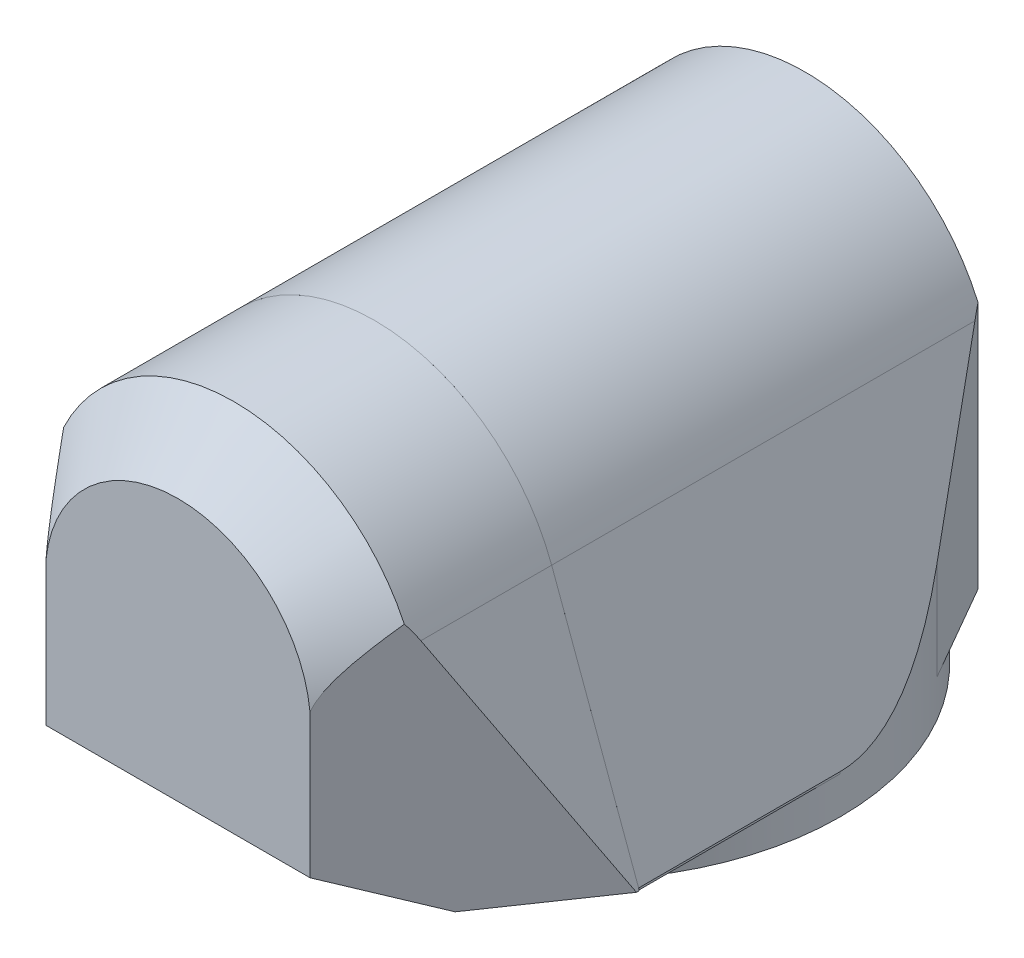
ISO-10303-21;
HEADER;
FILE_DESCRIPTION(('STEP AP214'),'2;1');
FILE_NAME('part.step','',(''),(''),'','','');
FILE_SCHEMA(('AUTOMOTIVE_DESIGN { 1 0 10303 214 1 1 1 1 }'));
ENDSEC;
DATA;
#1=APPLICATION_CONTEXT('core data for automotive mechanical design processes');
#2=APPLICATION_PROTOCOL_DEFINITION('international standard','automotive_design',2000,#1);
#3=PRODUCT_CONTEXT('',#1,'mechanical');
#4=PRODUCT('Part','Part','',(#3));
#5=PRODUCT_RELATED_PRODUCT_CATEGORY('part','',(#4));
#6=PRODUCT_DEFINITION_FORMATION('','',#4);
#7=PRODUCT_DEFINITION_CONTEXT('part definition',#1,'design');
#8=PRODUCT_DEFINITION('design','',#6,#7);
#9=PRODUCT_DEFINITION_SHAPE('','',#8);
#10=(LENGTH_UNIT() NAMED_UNIT(*) SI_UNIT(.MILLI.,.METRE.));
#11=(NAMED_UNIT(*) PLANE_ANGLE_UNIT() SI_UNIT($,.RADIAN.));
#12=(NAMED_UNIT(*) SI_UNIT($,.STERADIAN.) SOLID_ANGLE_UNIT());
#13=UNCERTAINTY_MEASURE_WITH_UNIT(LENGTH_MEASURE(1.E-05),#10,'distance_accuracy_value','');
#14=(GEOMETRIC_REPRESENTATION_CONTEXT(3) GLOBAL_UNCERTAINTY_ASSIGNED_CONTEXT((#13)) GLOBAL_UNIT_ASSIGNED_CONTEXT((#10,
#11,#12)) REPRESENTATION_CONTEXT('',''));
#15=CARTESIAN_POINT('',(0.,0.,0.));
#16=DIRECTION('',(0.,0.,1.));
#17=DIRECTION('',(1.,0.,0.));
#18=AXIS2_PLACEMENT_3D('',#15,#16,#17);
#19=CARTESIAN_POINT('',(624.999999998898,-0.0960085943478711,-5999404.5));
#20=DIRECTION('',(0.,0.,1.));
#21=DIRECTION('',(0.,1.,0.));
#22=AXIS2_PLACEMENT_3D('',#19,#20,#21);
#23=CYLINDRICAL_SURFACE('',#22,131.5);
#24=DIRECTION('',(0.,0.,1.));
#25=VECTOR('',#24,1.);
#26=CARTESIAN_POINT('',(501.607880138588,45.3642460903676,748.012532385));
#27=LINE('',#26,#25);
#28=CARTESIAN_POINT('',(501.607880138586,45.3642460903625,895.5));
#29=VERTEX_POINT('',#28);
#30=CARTESIAN_POINT('',(501.607880138574,45.3642460903694,600.525064770439));
#31=VERTEX_POINT('',#30);
#32=EDGE_CURVE('E270',#29,#31,#27,.F.);
#33=ORIENTED_EDGE('',*,*,#32,.F.);
#34=CARTESIAN_POINT('',(625.,-0.0960085954501144,895.5));
#35=DIRECTION('',(0.,0.,1.));
#36=DIRECTION('',(0.,1.,0.));
#37=AXIS2_PLACEMENT_3D('',#34,#35,#36);
#38=CIRCLE('',#37,131.5);
#39=CARTESIAN_POINT('',(748.392119861453,45.3642460903671,895.5));
#40=VERTEX_POINT('',#39);
#41=EDGE_CURVE('E248',#40,#29,#38,.T.);
#42=ORIENTED_EDGE('',*,*,#41,.F.);
#43=DIRECTION('',(0.,0.,1.));
#44=VECTOR('',#43,1.);
#45=CARTESIAN_POINT('',(748.392119860331,45.3642460914958,-5999404.5));
#46=LINE('',#45,#44);
#47=CARTESIAN_POINT('',(748.392119861436,45.3642460903994,600.525064770332));
#48=VERTEX_POINT('',#47);
#49=EDGE_CURVE('E278',#40,#48,#46,.F.);
#50=ORIENTED_EDGE('',*,*,#49,.T.);
#51=CARTESIAN_POINT('',(625.,-0.0960085954500312,386.130978732951));
#52=DIRECTION('',(-0.866704428360179,0.,0.498822046285903));
#53=DIRECTION('',(0.498822046285903,0.,0.866704428360179));
#54=AXIS2_PLACEMENT_3D('',#51,#52,#53);
#55=ELLIPSE('',#54,263.621066829573,131.5);
#56=CARTESIAN_POINT('',(745.499999999892,52.5537777291493,595.499999999817));
#57=VERTEX_POINT('',#56);
#58=EDGE_CURVE('E284',#48,#57,#55,.T.);
#59=ORIENTED_EDGE('',*,*,#58,.T.);
#60=CARTESIAN_POINT('',(625.,-0.0960085954500589,595.499999999817));
#61=DIRECTION('',(0.,0.,1.));
#62=DIRECTION('',(0.,1.,0.));
#63=AXIS2_PLACEMENT_3D('',#60,#61,#62);
#64=CIRCLE('',#63,131.5);
#65=CARTESIAN_POINT('',(504.500000000339,52.5537777296774,595.499999999817));
#66=VERTEX_POINT('',#65);
#67=EDGE_CURVE('E245',#66,#57,#64,.F.);
#68=ORIENTED_EDGE('',*,*,#67,.F.);
#69=CARTESIAN_POINT('',(625.,-0.0960085954500312,386.130978733861));
#70=DIRECTION('',(0.866704428360069,0.,0.498822046286095));
#71=DIRECTION('',(-0.498822046286095,0.,0.866704428360069));
#72=AXIS2_PLACEMENT_3D('',#69,#70,#71);
#73=ELLIPSE('',#72,263.621066829471,131.5);
#74=EDGE_CURVE('E259',#66,#31,#73,.T.);
#75=ORIENTED_EDGE('',*,*,#74,.T.);
#76=EDGE_LOOP('',(#33,#42,#50,#59,#68,#75));
#77=FACE_BOUND('',#76,.T.);
#78=ADVANCED_FACE('F18',(#77),#23,.T.);
#79=CARTESIAN_POINT('',(625.,6.7115156593229,595.5));
#80=DIRECTION('',(0.,0.,-1.));
#81=DIRECTION('',(0.,-1.,0.));
#82=AXIS2_PLACEMENT_3D('',#79,#80,#81);
#83=PLANE('',#82);
#84=ORIENTED_EDGE('',*,*,#67,.T.);
#85=DIRECTION('',(0.,-1.,0.));
#86=VECTOR('',#85,1.);
#87=CARTESIAN_POINT('',(745.5,6.7115156593229,595.5));
#88=LINE('',#87,#86);
#89=CARTESIAN_POINT('',(745.5,-120.5,595.5));
#90=VERTEX_POINT('',#89);
#91=EDGE_CURVE('E288',#57,#90,#88,.T.);
#92=ORIENTED_EDGE('',*,*,#91,.T.);
#93=DIRECTION('',(-1.,0.,0.));
#94=VECTOR('',#93,1.);
#95=CARTESIAN_POINT('',(625.,-120.5,595.5));
#96=LINE('',#95,#94);
#97=CARTESIAN_POINT('',(716.737396954574,-120.500000000178,595.5));
#98=VERTEX_POINT('',#97);
#99=EDGE_CURVE('E295',#90,#98,#96,.T.);
#100=ORIENTED_EDGE('',*,*,#99,.T.);
#101=DIRECTION('',(-1.,0.,0.));
#102=VECTOR('',#101,1.);
#103=CARTESIAN_POINT('',(625.00000000002,-120.5,595.5));
#104=LINE('',#103,#102);
#105=CARTESIAN_POINT('',(533.262603045422,-120.500000000178,595.5));
#106=VERTEX_POINT('',#105);
#107=EDGE_CURVE('E252',#106,#98,#104,.F.);
#108=ORIENTED_EDGE('',*,*,#107,.F.);
#109=DIRECTION('',(-1.,0.,0.));
#110=VECTOR('',#109,1.);
#111=CARTESIAN_POINT('',(625.,-120.5,595.5));
#112=LINE('',#111,#110);
#113=CARTESIAN_POINT('',(504.5,-120.5,595.5));
#114=VERTEX_POINT('',#113);
#115=EDGE_CURVE('E255',#106,#114,#112,.T.);
#116=ORIENTED_EDGE('',*,*,#115,.T.);
#117=DIRECTION('',(0.,-1.,0.));
#118=VECTOR('',#117,1.);
#119=CARTESIAN_POINT('',(504.5,6.71151565932292,595.5));
#120=LINE('',#119,#118);
#121=EDGE_CURVE('E263',#114,#66,#120,.F.);
#122=ORIENTED_EDGE('',*,*,#121,.T.);
#123=EDGE_LOOP('',(#84,#92,#100,#108,#116,#122));
#124=FACE_BOUND('',#123,.T.);
#125=ADVANCED_FACE('F447',(#124),#83,.T.);
#126=CARTESIAN_POINT('',(625.,5.46158088944987,895.5));
#127=DIRECTION('',(0.,0.,1.));
#128=DIRECTION('',(0.,1.,0.));
#129=AXIS2_PLACEMENT_3D('',#126,#127,#128);
#130=PLANE('',#129);
#131=DIRECTION('',(-0.345712683862874,-0.938340418087342,0.));
#132=VECTOR('',#131,1.);
#133=CARTESIAN_POINT('',(471.05411751075,-37.5693910360001,895.5));
#134=LINE('',#133,#132);
#135=CARTESIAN_POINT('',(501.608235021519,45.3612179279794,895.5));
#136=VERTEX_POINT('',#135);
#137=CARTESIAN_POINT('',(441.,-119.142873472147,895.5));
#138=VERTEX_POINT('',#137);
#139=EDGE_CURVE('E47',#136,#138,#134,.T.);
#140=ORIENTED_EDGE('',*,*,#139,.F.);
#141=CARTESIAN_POINT('',(625.,-0.1000000000001,895.5));
#142=DIRECTION('',(0.,0.,-1.));
#143=DIRECTION('',(0.,-1.,0.));
#144=AXIS2_PLACEMENT_3D('',#141,#142,#143);
#145=CIRCLE('',#144,131.5);
#146=CARTESIAN_POINT('',(748.391764978489,45.36121792796,895.5));
#147=VERTEX_POINT('',#146);
#148=EDGE_CURVE('E40',#136,#147,#145,.T.);
#149=ORIENTED_EDGE('',*,*,#148,.T.);
#150=DIRECTION('',(-0.345712683862974,0.938340418087306,0.));
#151=VECTOR('',#150,1.);
#152=CARTESIAN_POINT('',(778.94588248924,-37.5693910360001,895.5));
#153=LINE('',#152,#151);
#154=CARTESIAN_POINT('',(809.,-119.142873472148,895.5));
#155=VERTEX_POINT('',#154);
#156=EDGE_CURVE('E224',#155,#147,#153,.T.);
#157=ORIENTED_EDGE('',*,*,#156,.F.);
#158=DIRECTION('',(-0.345705358827259,0.938343116817146,0.));
#159=VECTOR('',#158,1.);
#160=CARTESIAN_POINT('',(809.,-119.14285714286,895.5));
#161=LINE('',#160,#159);
#162=EDGE_CURVE('E283',#155,#40,#161,.T.);
#163=ORIENTED_EDGE('',*,*,#162,.T.);
#164=ORIENTED_EDGE('',*,*,#41,.T.);
#165=DIRECTION('',(-0.34570535882751,-0.938343116817054,0.));
#166=VECTOR('',#165,1.);
#167=CARTESIAN_POINT('',(471.000900668607,-37.7118410423964,895.5));
#168=LINE('',#167,#166);
#169=EDGE_CURVE('E275',#138,#29,#168,.F.);
#170=ORIENTED_EDGE('',*,*,#169,.F.);
#171=EDGE_LOOP('',(#140,#149,#157,#163,#164,#170));
#172=FACE_BOUND('',#171,.T.);
#173=ADVANCED_FACE('F451',(#172),#130,.T.);
#174=CARTESIAN_POINT('',(625.00000000002,-120.5,753.159999999493));
#175=DIRECTION('',(0.,1.,0.));
#176=DIRECTION('',(-1.,0.,0.));
#177=AXIS2_PLACEMENT_3D('',#174,#175,#176);
#178=PLANE('',#177);
#179=ORIENTED_EDGE('',*,*,#107,.T.);
#180=CARTESIAN_POINT('',(625.,-120.500000000355,755.));
#181=DIRECTION('',(0.,1.,0.));
#182=DIRECTION('',(-1.,0.,0.));
#183=AXIS2_PLACEMENT_3D('',#180,#181,#182);
#184=CIRCLE('',#183,184.);
#185=EDGE_CURVE('E310',#98,#106,#184,.T.);
#186=ORIENTED_EDGE('',*,*,#185,.T.);
#187=EDGE_LOOP('',(#179,#186));
#188=FACE_BOUND('',#187,.T.);
#189=ADVANCED_FACE('F455',(#188),#178,.T.);
#190=CARTESIAN_POINT('',(625.,-120.5,745.5));
#191=DIRECTION('',(0.,1.,0.));
#192=DIRECTION('',(-1.,0.,0.));
#193=AXIS2_PLACEMENT_3D('',#190,#191,#192);
#194=PLANE('',#193);
#195=DIRECTION('',(0.498822046286095,0.,-0.866704428360069));
#196=VECTOR('',#195,1.);
#197=CARTESIAN_POINT('',(465.5263851817,-120.5,663.2167434834));
#198=LINE('',#197,#196);
#199=CARTESIAN_POINT('',(465.526385181715,-120.500000000178,663.216743483374));
#200=VERTEX_POINT('',#199);
#201=EDGE_CURVE('E258',#200,#114,#198,.T.);
#202=ORIENTED_EDGE('',*,*,#201,.T.);
#203=ORIENTED_EDGE('',*,*,#115,.F.);
#204=CARTESIAN_POINT('',(625.,-120.500000000355,755.));
#205=DIRECTION('',(0.,1.,0.));
#206=DIRECTION('',(-1.,0.,0.));
#207=AXIS2_PLACEMENT_3D('',#204,#205,#206);
#208=CIRCLE('',#207,184.);
#209=EDGE_CURVE('E336',#106,#200,#208,.T.);
#210=ORIENTED_EDGE('',*,*,#209,.T.);
#211=EDGE_LOOP('',(#202,#203,#210));
#212=FACE_BOUND('',#211,.T.);
#213=ADVANCED_FACE('F458',(#212),#194,.F.);
#214=CARTESIAN_POINT('',(485.01319259085,-33.9731111355501,629.3583717417));
#215=DIRECTION('',(0.866704428360069,0.,0.498822046286095));
#216=DIRECTION('',(0.498822046286095,0.,-0.866704428360069));
#217=AXIS2_PLACEMENT_3D('',#214,#215,#216);
#218=PLANE('',#217);
#219=ORIENTED_EDGE('',*,*,#74,.F.);
#220=ORIENTED_EDGE('',*,*,#121,.F.);
#221=ORIENTED_EDGE('',*,*,#201,.F.);
#222=DIRECTION('',(0.,1.,0.));
#223=VECTOR('',#222,1.);
#224=CARTESIAN_POINT('',(465.5263851817,-33.9731111355501,663.2167434834));
#225=LINE('',#224,#223);
#226=CARTESIAN_POINT('',(465.526385181708,-52.5712402217139,663.216743483405));
#227=VERTEX_POINT('',#226);
#228=EDGE_CURVE('E332',#200,#227,#225,.T.);
#229=ORIENTED_EDGE('',*,*,#228,.T.);
#230=DIRECTION('',(-0.296353071286836,-0.804386907778148,0.514914128504908));
#231=VECTOR('',#230,1.);
#232=CARTESIAN_POINT('',(501.607880138573,45.364246090326,600.525064769976));
#233=LINE('',#232,#231);
#234=EDGE_CURVE('E262',#31,#227,#233,.T.);
#235=ORIENTED_EDGE('',*,*,#234,.F.);
#236=EDGE_LOOP('',(#219,#220,#221,#229,#235));
#237=FACE_BOUND('',#236,.T.);
#238=ADVANCED_FACE('F462',(#237),#218,.F.);
#239=CARTESIAN_POINT('',(471.000900668607,-37.7118410423964,748.012532385));
#240=DIRECTION('',(-0.938343116817054,0.34570535882751,0.));
#241=DIRECTION('',(-0.34570535882751,-0.938343116817054,0.));
#242=AXIS2_PLACEMENT_3D('',#239,#240,#241);
#243=PLANE('',#242);
#244=ORIENTED_EDGE('',*,*,#169,.T.);
#245=ORIENTED_EDGE('',*,*,#32,.T.);
#246=ORIENTED_EDGE('',*,*,#234,.T.);
#247=CARTESIAN_POINT('',(625.,380.285714284219,755.));
#248=DIRECTION('',(-0.938343116817054,0.34570535882751,0.));
#249=DIRECTION('',(0.34570535882751,0.938343116817054,0.));
#250=AXIS2_PLACEMENT_3D('',#247,#248,#249);
#251=ELLIPSE('',#250,532.2451483658,184.);
#252=CARTESIAN_POINT('',(441.,-119.14285714348,755.));
#253=VERTEX_POINT('',#252);
#254=EDGE_CURVE('E328',#227,#253,#251,.T.);
#255=ORIENTED_EDGE('',*,*,#254,.T.);
#256=DIRECTION('',(0.,0.,1.));
#257=VECTOR('',#256,1.);
#258=CARTESIAN_POINT('',(441.,-119.14285714286,748.012532385));
#259=LINE('',#258,#257);
#260=EDGE_CURVE('E274',#253,#138,#259,.T.);
#261=ORIENTED_EDGE('',*,*,#260,.T.);
#262=EDGE_LOOP('',(#244,#245,#246,#255,#261));
#263=FACE_BOUND('',#262,.T.);
#264=ADVANCED_FACE('F378',(#263),#243,.T.);
#265=CARTESIAN_POINT('',(441.,-119.82142857143,825.25));
#266=DIRECTION('',(1.,0.,0.));
#267=DIRECTION('',(0.,1.,0.));
#268=AXIS2_PLACEMENT_3D('',#265,#266,#267);
#269=PLANE('',#268);
#270=ORIENTED_EDGE('',*,*,#260,.F.);
#271=DIRECTION('',(0.,1.,0.));
#272=VECTOR('',#271,1.);
#273=CARTESIAN_POINT('',(441.,-119.82142857143,755.));
#274=LINE('',#273,#272);
#275=CARTESIAN_POINT('',(441.,-120.500000000178,755.));
#276=VERTEX_POINT('',#275);
#277=EDGE_CURVE('E324',#253,#276,#274,.F.);
#278=ORIENTED_EDGE('',*,*,#277,.T.);
#279=DIRECTION('',(0.,0.,1.));
#280=VECTOR('',#279,1.);
#281=CARTESIAN_POINT('',(441.,-120.5,825.25));
#282=LINE('',#281,#280);
#283=CARTESIAN_POINT('',(441.,-120.5,895.5));
#284=VERTEX_POINT('',#283);
#285=EDGE_CURVE('E303',#276,#284,#282,.T.);
#286=ORIENTED_EDGE('',*,*,#285,.T.);
#287=DIRECTION('',(0.,1.,0.));
#288=VECTOR('',#287,1.);
#289=CARTESIAN_POINT('',(441.,5.46158088944988,895.5));
#290=LINE('',#289,#288);
#291=EDGE_CURVE('E216',#138,#284,#290,.F.);
#292=ORIENTED_EDGE('',*,*,#291,.F.);
#293=EDGE_LOOP('',(#270,#278,#286,#292));
#294=FACE_BOUND('',#293,.T.);
#295=ADVANCED_FACE('F383',(#294),#269,.F.);
#296=CARTESIAN_POINT('',(809.,-119.82142857143,825.25));
#297=DIRECTION('',(-1.,0.,0.));
#298=DIRECTION('',(0.,-1.,0.));
#299=AXIS2_PLACEMENT_3D('',#296,#297,#298);
#300=PLANE('',#299);
#301=DIRECTION('',(0.,0.,1.));
#302=VECTOR('',#301,1.);
#303=CARTESIAN_POINT('',(809.,-119.14285714286,825.25));
#304=LINE('',#303,#302);
#305=CARTESIAN_POINT('',(809.,-119.142857143686,755.000000000019));
#306=VERTEX_POINT('',#305);
#307=EDGE_CURVE('E353',#306,#155,#304,.T.);
#308=ORIENTED_EDGE('',*,*,#307,.T.);
#309=DIRECTION('',(0.,1.,0.));
#310=VECTOR('',#309,1.);
#311=CARTESIAN_POINT('',(809.,5.46158088944987,895.5));
#312=LINE('',#311,#310);
#313=CARTESIAN_POINT('',(809.,-120.5,895.5));
#314=VERTEX_POINT('',#313);
#315=EDGE_CURVE('E349',#314,#155,#312,.T.);
#316=ORIENTED_EDGE('',*,*,#315,.F.);
#317=DIRECTION('',(0.,0.,1.));
#318=VECTOR('',#317,1.);
#319=CARTESIAN_POINT('',(809.,-120.5,825.25));
#320=LINE('',#319,#318);
#321=CARTESIAN_POINT('',(809.,-120.500000000178,754.99999999999));
#322=VERTEX_POINT('',#321);
#323=EDGE_CURVE('E306',#314,#322,#320,.F.);
#324=ORIENTED_EDGE('',*,*,#323,.T.);
#325=DIRECTION('',(0.,-1.,0.));
#326=VECTOR('',#325,1.);
#327=CARTESIAN_POINT('',(809.,-119.82142857143,755.000000000019));
#328=LINE('',#327,#326);
#329=EDGE_CURVE('E320',#322,#306,#328,.F.);
#330=ORIENTED_EDGE('',*,*,#329,.T.);
#331=EDGE_LOOP('',(#308,#316,#324,#330));
#332=FACE_BOUND('',#331,.T.);
#333=ADVANCED_FACE('F471',(#332),#300,.F.);
#334=CARTESIAN_POINT('',(778.999099331418,-37.7118410423964,748.012532385));
#335=DIRECTION('',(-0.938343116817146,-0.345705358827259,0.));
#336=DIRECTION('',(0.345705358827259,-0.938343116817146,0.));
#337=AXIS2_PLACEMENT_3D('',#334,#335,#336);
#338=PLANE('',#337);
#339=ORIENTED_EDGE('',*,*,#162,.F.);
#340=ORIENTED_EDGE('',*,*,#307,.F.);
#341=CARTESIAN_POINT('',(625.,380.285714284219,755.));
#342=DIRECTION('',(-0.938343116817146,-0.345705358827259,0.));
#343=DIRECTION('',(-0.345705358827259,0.938343116817146,0.));
#344=AXIS2_PLACEMENT_3D('',#341,#342,#343);
#345=ELLIPSE('',#344,532.245148366187,184.);
#346=CARTESIAN_POINT('',(784.473614818289,-52.5712402218787,663.216743483416));
#347=VERTEX_POINT('',#346);
#348=EDGE_CURVE('E316',#306,#347,#345,.F.);
#349=ORIENTED_EDGE('',*,*,#348,.T.);
#350=DIRECTION('',(-0.296353071286602,0.804386907778178,-0.514914128504995));
#351=VECTOR('',#350,1.);
#352=CARTESIAN_POINT('',(784.473614818284,-52.5712402210386,663.2167434834));
#353=LINE('',#352,#351);
#354=EDGE_CURVE('E282',#347,#48,#353,.T.);
#355=ORIENTED_EDGE('',*,*,#354,.T.);
#356=ORIENTED_EDGE('',*,*,#49,.F.);
#357=EDGE_LOOP('',(#339,#340,#349,#355,#356));
#358=FACE_BOUND('',#357,.T.);
#359=ADVANCED_FACE('F474',(#358),#338,.F.);
#360=CARTESIAN_POINT('',(764.98680740914,-33.9731111355501,629.3583717417));
#361=DIRECTION('',(-0.866704428360179,0.,0.498822046285903));
#362=DIRECTION('',(0.498822046285903,0.,0.866704428360179));
#363=AXIS2_PLACEMENT_3D('',#360,#361,#362);
#364=PLANE('',#363);
#365=ORIENTED_EDGE('',*,*,#58,.F.);
#366=ORIENTED_EDGE('',*,*,#354,.F.);
#367=DIRECTION('',(0.,1.,0.));
#368=VECTOR('',#367,1.);
#369=CARTESIAN_POINT('',(784.47361481828,-33.9731111355501,663.2167434834));
#370=LINE('',#369,#368);
#371=CARTESIAN_POINT('',(784.473614818278,-120.500000000178,663.216743483396));
#372=VERTEX_POINT('',#371);
#373=EDGE_CURVE('E311',#347,#372,#370,.F.);
#374=ORIENTED_EDGE('',*,*,#373,.T.);
#375=DIRECTION('',(0.498822046285903,0.,0.866704428360179));
#376=VECTOR('',#375,1.);
#377=CARTESIAN_POINT('',(764.98680740914,-120.5,629.3583717417));
#378=LINE('',#377,#376);
#379=EDGE_CURVE('E299',#372,#90,#378,.F.);
#380=ORIENTED_EDGE('',*,*,#379,.T.);
#381=ORIENTED_EDGE('',*,*,#91,.F.);
#382=EDGE_LOOP('',(#365,#366,#374,#380,#381));
#383=FACE_BOUND('',#382,.T.);
#384=ADVANCED_FACE('F477',(#383),#364,.F.);
#385=CARTESIAN_POINT('',(625.,-120.5,745.5));
#386=DIRECTION('',(0.,1.,0.));
#387=DIRECTION('',(-1.,0.,0.));
#388=AXIS2_PLACEMENT_3D('',#385,#386,#387);
#389=PLANE('',#388);
#390=CARTESIAN_POINT('',(625.,-120.500000000355,755.));
#391=DIRECTION('',(0.,1.,0.));
#392=DIRECTION('',(-1.,0.,0.));
#393=AXIS2_PLACEMENT_3D('',#390,#391,#392);
#394=CIRCLE('',#393,184.);
#395=EDGE_CURVE('E315',#372,#98,#394,.T.);
#396=ORIENTED_EDGE('',*,*,#395,.T.);
#397=ORIENTED_EDGE('',*,*,#99,.F.);
#398=ORIENTED_EDGE('',*,*,#379,.F.);
#399=EDGE_LOOP('',(#396,#397,#398));
#400=FACE_BOUND('',#399,.T.);
#401=ADVANCED_FACE('F481',(#400),#389,.F.);
#402=CARTESIAN_POINT('',(625.,-120.5,745.5));
#403=DIRECTION('',(0.,1.,0.));
#404=DIRECTION('',(-1.,0.,0.));
#405=AXIS2_PLACEMENT_3D('',#402,#403,#404);
#406=PLANE('',#405);
#407=ORIENTED_EDGE('',*,*,#323,.F.);
#408=DIRECTION('',(1.,0.,0.));
#409=VECTOR('',#408,1.);
#410=CARTESIAN_POINT('',(625.,-120.5,895.5));
#411=LINE('',#410,#409);
#412=CARTESIAN_POINT('',(809.5,-120.5,895.5));
#413=VERTEX_POINT('',#412);
#414=EDGE_CURVE('E212',#314,#413,#411,.T.);
#415=ORIENTED_EDGE('',*,*,#414,.T.);
#416=DIRECTION('',(0.,0.,1.));
#417=VECTOR('',#416,1.);
#418=CARTESIAN_POINT('',(809.5,-120.5,941.0924958265));
#419=LINE('',#418,#417);
#420=CARTESIAN_POINT('',(809.5,-120.5,897.5));
#421=VERTEX_POINT('',#420);
#422=EDGE_CURVE('E218',#421,#413,#419,.F.);
#423=ORIENTED_EDGE('',*,*,#422,.F.);
#424=DIRECTION('',(0.565231440294017,0.,-0.824932372320999));
#425=VECTOR('',#424,1.);
#426=CARTESIAN_POINT('',(763.25,-120.5,965.));
#427=LINE('',#426,#425);
#428=CARTESIAN_POINT('',(758.111111111111,-120.5,972.5));
#429=VERTEX_POINT('',#428);
#430=EDGE_CURVE('E402',#429,#421,#427,.T.);
#431=ORIENTED_EDGE('',*,*,#430,.F.);
#432=DIRECTION('',(-1.,0.,0.));
#433=VECTOR('',#432,1.);
#434=CARTESIAN_POINT('',(625.,-120.5,972.5));
#435=LINE('',#434,#433);
#436=CARTESIAN_POINT('',(491.888888888888,-120.5,972.5));
#437=VERTEX_POINT('',#436);
#438=EDGE_CURVE('E403',#437,#429,#435,.F.);
#439=ORIENTED_EDGE('',*,*,#438,.F.);
#440=DIRECTION('',(-0.565231440294018,0.,-0.824932372320998));
#441=VECTOR('',#440,1.);
#442=CARTESIAN_POINT('',(491.888888888877,-120.5,972.499999999982));
#443=LINE('',#442,#441);
#444=CARTESIAN_POINT('',(440.5,-120.5,897.5));
#445=VERTEX_POINT('',#444);
#446=EDGE_CURVE('E210',#437,#445,#443,.T.);
#447=ORIENTED_EDGE('',*,*,#446,.T.);
#448=DIRECTION('',(0.,0.,1.));
#449=VECTOR('',#448,1.);
#450=CARTESIAN_POINT('',(440.5,-120.5,934.));
#451=LINE('',#450,#449);
#452=CARTESIAN_POINT('',(440.5,-120.5,895.5));
#453=VERTEX_POINT('',#452);
#454=EDGE_CURVE('E195',#445,#453,#451,.F.);
#455=ORIENTED_EDGE('',*,*,#454,.T.);
#456=EDGE_CURVE('E208',#453,#284,#411,.T.);
#457=ORIENTED_EDGE('',*,*,#456,.T.);
#458=ORIENTED_EDGE('',*,*,#285,.F.);
#459=CARTESIAN_POINT('',(625.,-120.500000000355,755.));
#460=DIRECTION('',(0.,1.,0.));
#461=DIRECTION('',(-1.,0.,0.));
#462=AXIS2_PLACEMENT_3D('',#459,#460,#461);
#463=CIRCLE('',#462,184.);
#464=EDGE_CURVE('E28',#276,#322,#463,.T.);
#465=ORIENTED_EDGE('',*,*,#464,.T.);
#466=EDGE_LOOP('',(#407,#415,#423,#431,#439,#447,#455,#457,#458,#465));
#467=FACE_BOUND('',#466,.T.);
#468=ADVANCED_FACE('F206',(#467),#406,.F.);
#469=CARTESIAN_POINT('',(624.999999999633,-6000146.5,754.999999998898));
#470=DIRECTION('',(0.,1.,0.));
#471=DIRECTION('',(-1.,0.,0.));
#472=AXIS2_PLACEMENT_3D('',#469,#470,#471);
#473=CYLINDRICAL_SURFACE('',#472,184.);
#474=ORIENTED_EDGE('',*,*,#464,.F.);
#475=ORIENTED_EDGE('',*,*,#277,.F.);
#476=ORIENTED_EDGE('',*,*,#254,.F.);
#477=ORIENTED_EDGE('',*,*,#228,.F.);
#478=ORIENTED_EDGE('',*,*,#209,.F.);
#479=ORIENTED_EDGE('',*,*,#185,.F.);
#480=ORIENTED_EDGE('',*,*,#395,.F.);
#481=ORIENTED_EDGE('',*,*,#373,.F.);
#482=ORIENTED_EDGE('',*,*,#348,.F.);
#483=ORIENTED_EDGE('',*,*,#329,.F.);
#484=EDGE_LOOP('',(#474,#475,#476,#477,#478,#479,#480,#481,#482,#483));
#485=FACE_BOUND('',#484,.T.);
#486=CARTESIAN_POINT('',(625.,-146.500000000195,755.));
#487=DIRECTION('',(0.,1.,0.));
#488=DIRECTION('',(-1.,0.,0.));
#489=AXIS2_PLACEMENT_3D('',#486,#487,#488);
#490=CIRCLE('',#489,184.);
#491=CARTESIAN_POINT('',(441.,-146.500000000195,755.));
#492=VERTEX_POINT('',#491);
#493=EDGE_CURVE('E11',#492,#492,#490,.T.);
#494=ORIENTED_EDGE('',*,*,#493,.T.);
#495=EDGE_LOOP('',(#494));
#496=FACE_BOUND('',#495,.T.);
#497=ADVANCED_FACE('F385',(#485,#496),#473,.T.);
#498=CARTESIAN_POINT('',(625.,-146.5,755.0184));
#499=DIRECTION('',(0.,1.,0.));
#500=DIRECTION('',(-1.,0.,0.));
#501=AXIS2_PLACEMENT_3D('',#498,#499,#500);
#502=PLANE('',#501);
#503=ORIENTED_EDGE('',*,*,#493,.F.);
#504=EDGE_LOOP('',(#503));
#505=FACE_BOUND('',#504,.T.);
#506=ADVANCED_FACE('F20',(#505),#502,.F.);
#507=CARTESIAN_POINT('',(625.,5.46064544109987,895.5));
#508=DIRECTION('',(0.,0.,-1.));
#509=DIRECTION('',(0.,-1.,0.));
#510=AXIS2_PLACEMENT_3D('',#507,#508,#509);
#511=PLANE('',#510);
#512=ORIENTED_EDGE('',*,*,#291,.T.);
#513=ORIENTED_EDGE('',*,*,#456,.F.);
#514=EDGE_CURVE('E191',#138,#453,#134,.T.);
#515=ORIENTED_EDGE('',*,*,#514,.F.);
#516=EDGE_LOOP('',(#512,#513,#515));
#517=FACE_BOUND('',#516,.T.);
#518=ADVANCED_FACE('F214',(#517),#511,.T.);
#519=ORIENTED_EDGE('',*,*,#315,.T.);
#520=EDGE_CURVE('E236',#413,#155,#153,.T.);
#521=ORIENTED_EDGE('',*,*,#520,.F.);
#522=ORIENTED_EDGE('',*,*,#414,.F.);
#523=EDGE_LOOP('',(#519,#521,#522));
#524=FACE_BOUND('',#523,.T.);
#525=ADVANCED_FACE('F394',(#524),#511,.T.);
#526=CARTESIAN_POINT('',(471.05411751075,-37.5693910360001,941.0924958265));
#527=DIRECTION('',(-0.938340418087342,0.345712683862874,0.));
#528=DIRECTION('',(-0.345712683862874,-0.938340418087342,0.));
#529=AXIS2_PLACEMENT_3D('',#526,#527,#528);
#530=PLANE('',#529);
#531=ORIENTED_EDGE('',*,*,#454,.F.);
#532=DIRECTION('',(0.308650586131994,0.837745716465744,0.450463017598197));
#533=VECTOR('',#532,1.);
#534=CARTESIAN_POINT('',(440.5,-120.5,897.5));
#535=LINE('',#534,#533);
#536=CARTESIAN_POINT('',(501.6082350215,45.3612179279996,986.684991652969));
#537=VERTEX_POINT('',#536);
#538=EDGE_CURVE('E531',#445,#537,#535,.T.);
#539=ORIENTED_EDGE('',*,*,#538,.T.);
#540=DIRECTION('',(0.,0.,1.));
#541=VECTOR('',#540,1.);
#542=CARTESIAN_POINT('',(501.6082350215,45.3612179279996,941.0924958265));
#543=LINE('',#542,#541);
#544=EDGE_CURVE('E239',#537,#136,#543,.F.);
#545=ORIENTED_EDGE('',*,*,#544,.T.);
#546=ORIENTED_EDGE('',*,*,#139,.T.);
#547=ORIENTED_EDGE('',*,*,#514,.T.);
#548=EDGE_LOOP('',(#531,#539,#545,#546,#547));
#549=FACE_BOUND('',#548,.T.);
#550=ADVANCED_FACE('F193',(#549),#530,.T.);
#551=CARTESIAN_POINT('',(778.94588248924,-37.5693910360001,941.0924958265));
#552=DIRECTION('',(0.938340418087306,0.345712683862974,0.));
#553=DIRECTION('',(-0.345712683862974,0.938340418087306,0.));
#554=AXIS2_PLACEMENT_3D('',#551,#552,#553);
#555=PLANE('',#554);
#556=DIRECTION('',(0.,0.,1.));
#557=VECTOR('',#556,1.);
#558=CARTESIAN_POINT('',(748.391764978497,45.3612179279552,941.0924958265));
#559=LINE('',#558,#557);
#560=CARTESIAN_POINT('',(748.391764978495,45.3612179279546,986.684991652963));
#561=VERTEX_POINT('',#560);
#562=EDGE_CURVE('E230',#147,#561,#559,.T.);
#563=ORIENTED_EDGE('',*,*,#562,.T.);
#564=DIRECTION('',(-0.30865058613211,0.837745716465692,0.450463017598215));
#565=VECTOR('',#564,1.);
#566=CARTESIAN_POINT('',(809.5,-120.5,897.5));
#567=LINE('',#566,#565);
#568=EDGE_CURVE('E400',#421,#561,#567,.T.);
#569=ORIENTED_EDGE('',*,*,#568,.F.);
#570=ORIENTED_EDGE('',*,*,#422,.T.);
#571=ORIENTED_EDGE('',*,*,#520,.T.);
#572=ORIENTED_EDGE('',*,*,#156,.T.);
#573=EDGE_LOOP('',(#563,#569,#570,#571,#572));
#574=FACE_BOUND('',#573,.T.);
#575=ADVANCED_FACE('F397',(#574),#555,.T.);
#576=CARTESIAN_POINT('',(625.000000001103,-0.100000001102302,6000993.5));
#577=DIRECTION('',(0.,0.,-1.));
#578=DIRECTION('',(0.,-1.,0.));
#579=AXIS2_PLACEMENT_3D('',#576,#577,#578);
#580=CYLINDRICAL_SURFACE('',#579,131.5);
#581=ORIENTED_EDGE('',*,*,#562,.F.);
#582=ORIENTED_EDGE('',*,*,#148,.F.);
#583=ORIENTED_EDGE('',*,*,#544,.F.);
#584=CARTESIAN_POINT('',(625.,-0.100000000000142,1166.77027027018));
#585=DIRECTION('',(0.824932372320999,0.,-0.565231440294018));
#586=DIRECTION('',(-0.565231440294018,0.,-0.824932372320999));
#587=AXIS2_PLACEMENT_3D('',#584,#585,#586);
#588=ELLIPSE('',#587,232.648063475728,131.5);
#589=CARTESIAN_POINT('',(506.277777467216,56.4445300349745,993.499999546656));
#590=VERTEX_POINT('',#589);
#591=EDGE_CURVE('E523',#537,#590,#588,.T.);
#592=ORIENTED_EDGE('',*,*,#591,.T.);
#593=CARTESIAN_POINT('',(625.,-0.100000000000114,993.499999162311));
#594=DIRECTION('',(0.,0.,-1.));
#595=DIRECTION('',(0.,-1.,0.));
#596=AXIS2_PLACEMENT_3D('',#593,#594,#595);
#597=CIRCLE('',#596,131.5);
#598=CARTESIAN_POINT('',(743.722222532485,56.4445300356017,993.499999547092));
#599=VERTEX_POINT('',#598);
#600=EDGE_CURVE('E408',#590,#599,#597,.T.);
#601=ORIENTED_EDGE('',*,*,#600,.T.);
#602=CARTESIAN_POINT('',(625.,-0.100000000000142,1166.77027027018));
#603=DIRECTION('',(0.824932372320999,0.,0.565231440294017));
#604=DIRECTION('',(0.565231440294017,0.,-0.824932372320999));
#605=AXIS2_PLACEMENT_3D('',#602,#603,#604);
#606=ELLIPSE('',#605,232.648063475728,131.5);
#607=EDGE_CURVE('E407',#561,#599,#606,.T.);
#608=ORIENTED_EDGE('',*,*,#607,.F.);
#609=EDGE_LOOP('',(#581,#582,#583,#592,#601,#608));
#610=FACE_BOUND('',#609,.T.);
#611=ADVANCED_FACE('F506',(#610),#580,.T.);
#612=CARTESIAN_POINT('',(625.,-105.5,1002.5));
#613=DIRECTION('',(0.,-0.894427190999916,0.447213595499958));
#614=DIRECTION('',(0.,0.447213595499958,0.894427190999916));
#615=AXIS2_PLACEMENT_3D('',#612,#613,#614);
#616=PLANE('',#615);
#617=ORIENTED_EDGE('',*,*,#438,.T.);
#618=DIRECTION('',(0.522527990253466,-0.381304209103873,-0.762608418207761));
#619=VECTOR('',#618,1.);
#620=CARTESIAN_POINT('',(717.,-90.5000000000024,1032.5));
#621=LINE('',#620,#619);
#622=CARTESIAN_POINT('',(717.,-90.5,1032.5));
#623=VERTEX_POINT('',#622);
#624=EDGE_CURVE('E419',#623,#429,#621,.T.);
#625=ORIENTED_EDGE('',*,*,#624,.F.);
#626=DIRECTION('',(-1.,0.,0.));
#627=VECTOR('',#626,1.);
#628=CARTESIAN_POINT('',(625.,-90.5,1032.5));
#629=LINE('',#628,#627);
#630=CARTESIAN_POINT('',(533.,-90.5,1032.5));
#631=VERTEX_POINT('',#630);
#632=EDGE_CURVE('E553',#623,#631,#629,.T.);
#633=ORIENTED_EDGE('',*,*,#632,.T.);
#634=DIRECTION('',(-0.52252799025343,-0.381304209103889,-0.762608418207778));
#635=VECTOR('',#634,1.);
#636=CARTESIAN_POINT('',(533.,-90.4999999999956,1032.5));
#637=LINE('',#636,#635);
#638=EDGE_CURVE('E525',#631,#437,#637,.T.);
#639=ORIENTED_EDGE('',*,*,#638,.T.);
#640=EDGE_LOOP('',(#617,#625,#633,#639));
#641=FACE_BOUND('',#640,.T.);
#642=ADVANCED_FACE('F509',(#641),#616,.T.);
#643=CARTESIAN_POINT('',(486.75,-32.0277346431002,965.));
#644=DIRECTION('',(0.824932372320999,0.,-0.565231440294018));
#645=DIRECTION('',(-0.565231440294018,0.,-0.824932372320999));
#646=AXIS2_PLACEMENT_3D('',#643,#644,#645);
#647=PLANE('',#646);
#648=CARTESIAN_POINT('',(532.999999050842,9.50468551252134,1032.49999845538));
#649=CARTESIAN_POINT('',(532.806613345502,10.3700097956951,1032.21775996059));
#650=CARTESIAN_POINT('',(532.592276807603,11.2196740528517,1031.90494451471));
#651=CARTESIAN_POINT('',(532.128819420168,12.8871002570247,1031.22854727714));
#652=CARTESIAN_POINT('',(531.879759397449,13.7049148589834,1030.86505425982));
#653=CARTESIAN_POINT('',(531.354983887516,15.3057788578723,1030.09916566962));
#654=CARTESIAN_POINT('',(531.079454011975,16.0890211482519,1029.69704098936));
#655=CARTESIAN_POINT('',(530.505381990653,17.629057247934,1028.85920614961));
#656=CARTESIAN_POINT('',(530.206828782741,18.3858380861648,1028.42347984537));
#657=CARTESIAN_POINT('',(529.594723565617,19.8660656394124,1027.53013709548));
#658=CARTESIAN_POINT('',(529.281395791153,20.5898042451202,1027.07284791134));
#659=CARTESIAN_POINT('',(528.639615690211,22.0160615796424,1026.13619587228));
#660=CARTESIAN_POINT('',(528.311161244504,22.7185773121863,1025.65682992443));
#661=CARTESIAN_POINT('',(527.641079053396,24.1058668209281,1024.67887213196));
#662=CARTESIAN_POINT('',(527.299427871701,24.7906050469249,1024.18024608302));
#663=CARTESIAN_POINT('',(526.605541060673,26.1430971388105,1023.16754641288));
#664=CARTESIAN_POINT('',(526.253304923014,26.81085018616,1022.6534720498));
#665=CARTESIAN_POINT('',(525.532848509213,28.1442349871353,1021.60199512155));
#666=CARTESIAN_POINT('',(525.164449959672,28.8095646439099,1021.06433237357));
#667=CARTESIAN_POINT('',(524.419736392659,30.1261819325804,1019.97745311361));
#668=CARTESIAN_POINT('',(524.043421312326,30.7774694528912,1019.42823650988));
#669=CARTESIAN_POINT('',(522.904220329266,32.7128005634592,1017.76561885893));
#670=CARTESIAN_POINT('',(522.13117240908,33.9781412076025,1016.6373867592));
#671=CARTESIAN_POINT('',(520.564758407257,36.4688064446259,1014.35126902681));
#672=CARTESIAN_POINT('',(519.771390346234,37.6941271125014,1013.19338050531));
#673=CARTESIAN_POINT('',(518.168912176919,40.1121949733987,1010.85462858253));
#674=CARTESIAN_POINT('',(517.359801274316,41.3049405154919,1009.67376402197));
#675=CARTESIAN_POINT('',(516.126265565734,43.0891384665885,1007.8734686635));
#676=CARTESIAN_POINT('',(515.706406629196,43.690521726811,1007.26070156693));
#677=CARTESIAN_POINT('',(514.863771297077,44.8868059843121,1006.0309094606));
#678=CARTESIAN_POINT('',(514.440995002576,45.4817072043546,1005.41388459835));
#679=CARTESIAN_POINT('',(513.168692258018,47.2576579509791,1003.55701032251));
#680=CARTESIAN_POINT('',(512.315233540509,48.4298946119505,1002.31142192399));
#681=CARTESIAN_POINT('',(510.601710239052,50.7520695642124,999.810604132671));
#682=CARTESIAN_POINT('',(509.741664590749,51.902051686488,998.555402375688));
#683=CARTESIAN_POINT('',(508.44637845151,53.6144685559507,996.664984767068));
#684=CARTESIAN_POINT('',(508.013770714517,54.1831505489268,996.033611313079));
#685=CARTESIAN_POINT('',(507.146945669353,55.3166563059494,994.768515301218));
#686=CARTESIAN_POINT('',(506.712728367298,55.8814800846337,994.134792752272));
#687=CARTESIAN_POINT('',(506.277777181577,56.4445296037204,993.499999129869));
#688=B_SPLINE_CURVE_WITH_KNOTS('',3,(#648,#649,#650,#651,#652,#653,#654,#655,#656,#657,#658,
#659,#660,#661,#662,#663,#664,#665,#666,#667,#668,#669,#670,#671,#672,#673,#674,#675,#676,#677,
#678,#679,#680,#681,#682,#683,#684,#685,#686,#687),.UNSPECIFIED.,.F.,.F.,(4,2,2,2,2,2,2,2,2,2,2,
2,2,2,2,2,2,2,2,4),(0.,2.78930483787202,5.57378351328604,8.33999285612531,11.107539674477,
13.84171903519,16.5762826235387,19.3159485828008,22.0557463211704,24.8496296661731,
27.643535204449,33.232061434977,38.8211341306507,44.4104895605276,47.2776629822196,
50.1447375570093,55.8791714231741,61.6008393194995,64.461358842436,67.3218675066868),.UNSPECIFIED.);
#689=CARTESIAN_POINT('',(532.999999490607,9.50468323204658,1032.49999925693));
#690=VERTEX_POINT('',#689);
#691=EDGE_CURVE('E415',#690,#590,#688,.T.);
#692=ORIENTED_EDGE('',*,*,#691,.T.);
#693=ORIENTED_EDGE('',*,*,#591,.F.);
#694=ORIENTED_EDGE('',*,*,#538,.F.);
#695=ORIENTED_EDGE('',*,*,#446,.F.);
#696=ORIENTED_EDGE('',*,*,#638,.F.);
#697=DIRECTION('',(0.,1.,0.));
#698=VECTOR('',#697,1.);
#699=CARTESIAN_POINT('',(533.,-32.0277346431002,1032.5));
#700=LINE('',#699,#698);
#701=EDGE_CURVE('E558',#631,#690,#700,.T.);
#702=ORIENTED_EDGE('',*,*,#701,.T.);
#703=EDGE_LOOP('',(#692,#693,#694,#695,#696,#702));
#704=FACE_BOUND('',#703,.T.);
#705=ADVANCED_FACE('F512',(#704),#647,.F.);
#706=CARTESIAN_POINT('',(624.999999998978,-0.0999999990152767,-1009040.76190723));
#707=DIRECTION('',(0.,0.,-1.));
#708=DIRECTION('',(0.,-1.,0.));
#709=AXIS2_PLACEMENT_3D('',#706,#707,#708);
#710=CONICAL_SURFACE('',#709,1010165.75576853,0.785398160358987);
#711=ORIENTED_EDGE('',*,*,#600,.F.);
#712=ORIENTED_EDGE('',*,*,#691,.F.);
#713=CARTESIAN_POINT('',(624.999999999163,-0.0999999992008227,1032.49999972311));
#714=DIRECTION('',(0.,0.,-1.));
#715=DIRECTION('',(0.,-1.,0.));
#716=AXIS2_PLACEMENT_3D('',#713,#714,#715);
#717=CIRCLE('',#716,92.4999997151872);
#718=CARTESIAN_POINT('',(717.000000515961,9.50468458264211,1032.49999910853));
#719=VERTEX_POINT('',#718);
#720=EDGE_CURVE('E432',#690,#719,#717,.T.);
#721=ORIENTED_EDGE('',*,*,#720,.T.);
#722=CARTESIAN_POINT('',(743.722222900399,56.4445296172424,993.499999201808));
#723=CARTESIAN_POINT('',(742.963788867786,55.4626397946759,994.606902802309));
#724=CARTESIAN_POINT('',(742.207535808543,54.4754373349714,995.710623432998));
#725=CARTESIAN_POINT('',(740.700230341843,52.4885166493662,997.910474617789));
#726=CARTESIAN_POINT('',(739.949178261112,51.4887976480578,999.006604695053));
#727=CARTESIAN_POINT('',(738.451678058694,49.4730155879206,1001.19214554092));
#728=CARTESIAN_POINT('',(737.705242497429,48.4569232793078,1002.28153797806));
#729=CARTESIAN_POINT('',(736.219730010273,46.4080721669249,1004.44958322692));
#730=CARTESIAN_POINT('',(735.480652936204,45.3753136998631,1005.5282362549));
#731=CARTESIAN_POINT('',(733.974584900779,43.2381002307686,1007.72628149654));
#732=CARTESIAN_POINT('',(733.208047297403,42.1326432321541,1008.84501205254));
#733=CARTESIAN_POINT('',(731.687022775925,39.8960827559991,1011.06488567828));
#734=CARTESIAN_POINT('',(730.932535521944,38.7649799954149,1012.16602923822));
#735=CARTESIAN_POINT('',(729.439330244135,36.472826435997,1014.34530180588));
#736=CARTESIAN_POINT('',(728.700599292363,35.3118020625566,1015.42344968142));
#737=CARTESIAN_POINT('',(727.24254316433,32.9522554975433,1017.55142348989));
#738=CARTESIAN_POINT('',(726.523215778399,31.7537376095745,1018.60125264774));
#739=CARTESIAN_POINT('',(725.457802967466,29.9115763967019,1020.15617945289));
#740=CARTESIAN_POINT('',(725.102227573612,29.2850935302341,1020.675127325));
#741=CARTESIAN_POINT('',(724.398771656325,28.0187681954313,1021.7017927178));
#742=CARTESIAN_POINT('',(724.050890799505,27.3789263082555,1022.20951072505));
#743=CARTESIAN_POINT('',(723.363859293809,26.083818579951,1023.21220535498));
#744=CARTESIAN_POINT('',(723.024715266049,25.4285417220519,1023.70717231442));
#745=CARTESIAN_POINT('',(722.3570496732,24.1012409270107,1024.68160317965));
#746=CARTESIAN_POINT('',(722.028527878083,23.4292173530828,1025.16106742118));
#747=CARTESIAN_POINT('',(721.388660288754,22.0760359082974,1026.09492822722));
#748=CARTESIAN_POINT('',(721.077137542696,21.3951407331907,1026.5495830458));
#749=CARTESIAN_POINT('',(720.468740749624,20.0129637998519,1027.43751350055));
#750=CARTESIAN_POINT('',(720.171868242551,19.3116799107478,1027.87078688925));
#751=CARTESIAN_POINT('',(719.596202908998,17.8875759890978,1028.71094710579));
#752=CARTESIAN_POINT('',(719.317386708067,17.1647856420723,1029.11786804769));
#753=CARTESIAN_POINT('',(718.781203019274,15.6948512705443,1029.9004064043));
#754=CARTESIAN_POINT('',(718.523827898561,14.9477160455265,1030.27603495886));
#755=CARTESIAN_POINT('',(718.158575726372,13.8114698063259,1030.80910569665));
#756=CARTESIAN_POINT('',(718.040868871771,13.4322011086047,1030.98089407904));
#757=CARTESIAN_POINT('',(717.812466216646,12.6671270957513,1031.31423849462));
#758=CARTESIAN_POINT('',(717.701769879739,12.2813222835759,1031.47579531065));
#759=CARTESIAN_POINT('',(717.487500137685,11.5010104742395,1031.78851331257));
#760=CARTESIAN_POINT('',(717.383967794157,11.1064680814738,1031.93961457069));
#761=CARTESIAN_POINT('',(717.185406512949,10.3106154354399,1032.22940671083));
#762=CARTESIAN_POINT('',(717.090380010567,9.9093032827665,1032.36809403863));
#763=CARTESIAN_POINT('',(717.000001031767,9.50468555861222,1032.49999849418));
#764=B_SPLINE_CURVE_WITH_KNOTS('',3,(#722,#723,#724,#725,#726,#727,#728,#729,#730,#731,#732,
#733,#734,#735,#736,#737,#738,#739,#740,#741,#742,#743,#744,#745,#746,#747,#748,#749,#750,#751,
#752,#753,#754,#755,#756,#757,#758,#759,#760,#761,#762,#763),.UNSPECIFIED.,.F.,.F.,(4,2,2,2,2,2,
2,2,2,2,2,2,2,2,2,2,2,2,2,2,4),(0.,4.98811661660668,9.97654379456038,14.97517517034,
19.9737056843356,25.2223104193223,30.4707686041163,35.7147405167255,40.9581127051714,
43.6214040006624,46.284579675066,48.9497175322126,51.6147976362228,54.2422719199954,
56.870021801418,59.4942990202437,62.1176379894979,63.4154874307893,64.7132374516144,
66.0178969195351,67.3229287362017),.UNSPECIFIED.);
#765=EDGE_CURVE('E422',#599,#719,#764,.T.);
#766=ORIENTED_EDGE('',*,*,#765,.F.);
#767=EDGE_LOOP('',(#711,#712,#721,#766));
#768=FACE_BOUND('',#767,.T.);
#769=ADVANCED_FACE('F434',(#768),#710,.T.);
#770=CARTESIAN_POINT('',(763.25,-32.0277346431002,965.));
#771=DIRECTION('',(0.824932372320999,0.,0.565231440294017));
#772=DIRECTION('',(0.565231440294017,0.,-0.824932372320999));
#773=AXIS2_PLACEMENT_3D('',#770,#771,#772);
#774=PLANE('',#773);
#775=DIRECTION('',(0.,1.,0.));
#776=VECTOR('',#775,1.);
#777=CARTESIAN_POINT('',(717.,-32.0277346431002,1032.5));
#778=LINE('',#777,#776);
#779=EDGE_CURVE('E249',#719,#623,#778,.F.);
#780=ORIENTED_EDGE('',*,*,#779,.T.);
#781=ORIENTED_EDGE('',*,*,#624,.T.);
#782=ORIENTED_EDGE('',*,*,#430,.T.);
#783=ORIENTED_EDGE('',*,*,#568,.T.);
#784=ORIENTED_EDGE('',*,*,#607,.T.);
#785=ORIENTED_EDGE('',*,*,#765,.T.);
#786=EDGE_LOOP('',(#780,#781,#782,#783,#784,#785));
#787=FACE_BOUND('',#786,.T.);
#788=ADVANCED_FACE('F437',(#787),#774,.T.);
#789=CARTESIAN_POINT('',(625.,0.957344099899837,1032.5));
#790=DIRECTION('',(0.,0.,-1.));
#791=DIRECTION('',(0.,-1.,0.));
#792=AXIS2_PLACEMENT_3D('',#789,#790,#791);
#793=PLANE('',#792);
#794=ORIENTED_EDGE('',*,*,#720,.F.);
#795=ORIENTED_EDGE('',*,*,#701,.F.);
#796=ORIENTED_EDGE('',*,*,#632,.F.);
#797=ORIENTED_EDGE('',*,*,#779,.F.);
#798=EDGE_LOOP('',(#794,#795,#796,#797));
#799=FACE_BOUND('',#798,.T.);
#800=ADVANCED_FACE('F441',(#799),#793,.F.);
#801=CLOSED_SHELL('',(#78,#125,#173,#189,#213,#238,#264,#295,#333,#359,#384,#401,#468,#497,#506,
#518,#525,#550,#575,#611,#642,#705,#769,#788,#800));
#802=MANIFOLD_SOLID_BREP('B1',#801);
#803=ADVANCED_BREP_SHAPE_REPRESENTATION('',(#18,#802),#14);
#804=SHAPE_DEFINITION_REPRESENTATION(#9,#803);
ENDSEC;
END-ISO-10303-21;
